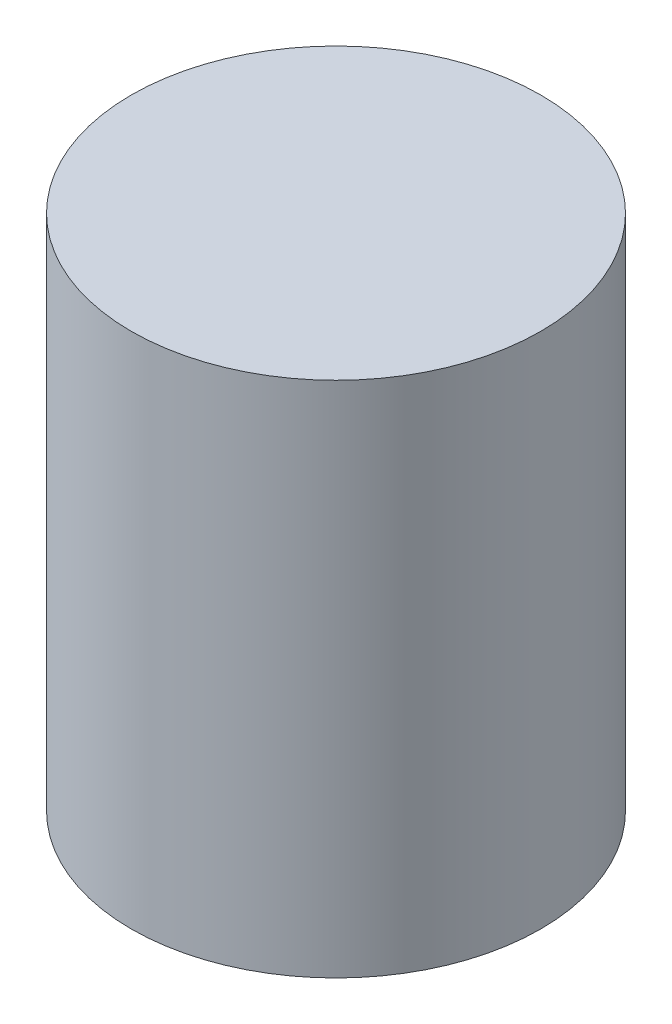
ISO-10303-21;
HEADER;
FILE_DESCRIPTION(('STEP AP214'),'2;1');
FILE_NAME('part.step','',(''),(''),'','','');
FILE_SCHEMA(('AUTOMOTIVE_DESIGN { 1 0 10303 214 1 1 1 1 }'));
ENDSEC;
DATA;
#1=APPLICATION_CONTEXT('core data for automotive mechanical design processes');
#2=APPLICATION_PROTOCOL_DEFINITION('international standard','automotive_design',2000,#1);
#3=PRODUCT_CONTEXT('',#1,'mechanical');
#4=PRODUCT('Part','Part','',(#3));
#5=PRODUCT_RELATED_PRODUCT_CATEGORY('part','',(#4));
#6=PRODUCT_DEFINITION_FORMATION('','',#4);
#7=PRODUCT_DEFINITION_CONTEXT('part definition',#1,'design');
#8=PRODUCT_DEFINITION('design','',#6,#7);
#9=PRODUCT_DEFINITION_SHAPE('','',#8);
#10=(LENGTH_UNIT() NAMED_UNIT(*) SI_UNIT(.MILLI.,.METRE.));
#11=(NAMED_UNIT(*) PLANE_ANGLE_UNIT() SI_UNIT($,.RADIAN.));
#12=(NAMED_UNIT(*) SI_UNIT($,.STERADIAN.) SOLID_ANGLE_UNIT());
#13=UNCERTAINTY_MEASURE_WITH_UNIT(LENGTH_MEASURE(1.E-05),#10,'distance_accuracy_value','');
#14=(GEOMETRIC_REPRESENTATION_CONTEXT(3) GLOBAL_UNCERTAINTY_ASSIGNED_CONTEXT((#13)) GLOBAL_UNIT_ASSIGNED_CONTEXT((#10,
#11,#12)) REPRESENTATION_CONTEXT('',''));
#15=CARTESIAN_POINT('',(0.,0.,0.));
#16=DIRECTION('',(0.,0.,1.));
#17=DIRECTION('',(1.,0.,0.));
#18=AXIS2_PLACEMENT_3D('',#15,#16,#17);
#19=CARTESIAN_POINT('',(0.,0.,0.));
#20=DIRECTION('',(0.,1.,0.));
#21=DIRECTION('',(0.,0.,1.));
#22=AXIS2_PLACEMENT_3D('',#19,#20,#21);
#23=PLANE('',#22);
#24=CARTESIAN_POINT('',(0.,0.,0.));
#25=DIRECTION('',(0.,1.,0.));
#26=DIRECTION('',(1.,0.,0.));
#27=AXIS2_PLACEMENT_3D('',#24,#25,#26);
#28=CIRCLE('',#27,25.);
#29=CARTESIAN_POINT('',(25.,0.,0.));
#30=VERTEX_POINT('',#29);
#31=EDGE_CURVE('E53',#30,#30,#28,.T.);
#32=ORIENTED_EDGE('',*,*,#31,.F.);
#33=EDGE_LOOP('',(#32));
#34=FACE_BOUND('',#33,.T.);
#35=CARTESIAN_POINT('',(0.,0.,0.));
#36=DIRECTION('',(0.,1.,0.));
#37=DIRECTION('',(0.,0.,1.));
#38=AXIS2_PLACEMENT_3D('',#35,#36,#37);
#39=CIRCLE('',#38,23.);
#40=CARTESIAN_POINT('',(0.,0.,23.));
#41=VERTEX_POINT('',#40);
#42=EDGE_CURVE('E58',#41,#41,#39,.T.);
#43=ORIENTED_EDGE('',*,*,#42,.T.);
#44=EDGE_LOOP('',(#43));
#45=FACE_BOUND('',#44,.T.);
#46=ADVANCED_FACE('F41',(#34,#45),#23,.F.);
#47=CARTESIAN_POINT('',(0.,30.,0.));
#48=DIRECTION('',(0.,-1.,0.));
#49=DIRECTION('',(0.,0.,-1.));
#50=AXIS2_PLACEMENT_3D('',#47,#48,#49);
#51=CYLINDRICAL_SURFACE('',#50,25.);
#52=CARTESIAN_POINT('',(0.,30.,0.));
#53=DIRECTION('',(0.,1.,0.));
#54=DIRECTION('',(1.,0.,0.));
#55=AXIS2_PLACEMENT_3D('',#52,#53,#54);
#56=CIRCLE('',#55,25.);
#57=CARTESIAN_POINT('',(25.,30.,0.));
#58=VERTEX_POINT('',#57);
#59=EDGE_CURVE('E49',#58,#58,#56,.T.);
#60=ORIENTED_EDGE('',*,*,#59,.F.);
#61=EDGE_LOOP('',(#60));
#62=FACE_BOUND('',#61,.T.);
#63=ORIENTED_EDGE('',*,*,#31,.T.);
#64=EDGE_LOOP('',(#63));
#65=FACE_BOUND('',#64,.T.);
#66=ADVANCED_FACE('F43',(#62,#65),#51,.T.);
#67=CARTESIAN_POINT('',(0.,30.,0.));
#68=DIRECTION('',(0.,-1.,0.));
#69=DIRECTION('',(0.,0.,-1.));
#70=AXIS2_PLACEMENT_3D('',#67,#68,#69);
#71=CYLINDRICAL_SURFACE('',#70,23.);
#72=CARTESIAN_POINT('',(0.,30.,0.));
#73=DIRECTION('',(0.,1.,0.));
#74=DIRECTION('',(0.,0.,1.));
#75=AXIS2_PLACEMENT_3D('',#72,#73,#74);
#76=CIRCLE('',#75,23.);
#77=CARTESIAN_POINT('',(0.,30.,23.));
#78=VERTEX_POINT('',#77);
#79=EDGE_CURVE('E62',#78,#78,#76,.T.);
#80=ORIENTED_EDGE('',*,*,#79,.T.);
#81=EDGE_LOOP('',(#80));
#82=FACE_BOUND('',#81,.T.);
#83=ORIENTED_EDGE('',*,*,#42,.F.);
#84=EDGE_LOOP('',(#83));
#85=FACE_BOUND('',#84,.T.);
#86=ADVANCED_FACE('F88',(#82,#85),#71,.F.);
#87=CARTESIAN_POINT('',(0.,30.,0.));
#88=DIRECTION('',(0.,1.,0.));
#89=DIRECTION('',(0.,0.,1.));
#90=AXIS2_PLACEMENT_3D('',#87,#88,#89);
#91=PLANE('',#90);
#92=ORIENTED_EDGE('',*,*,#79,.F.);
#93=EDGE_LOOP('',(#92));
#94=FACE_BOUND('',#93,.T.);
#95=ADVANCED_FACE('F80',(#94),#91,.F.);
#96=CARTESIAN_POINT('',(0.,32.,0.));
#97=DIRECTION('',(0.,-1.,0.));
#98=DIRECTION('',(0.,0.,-1.));
#99=AXIS2_PLACEMENT_3D('',#96,#97,#98);
#100=CYLINDRICAL_SURFACE('',#99,140.);
#101=CARTESIAN_POINT('',(0.,30.,0.));
#102=DIRECTION('',(0.,1.,0.));
#103=DIRECTION('',(0.,0.,1.));
#104=AXIS2_PLACEMENT_3D('',#101,#102,#103);
#105=CIRCLE('',#104,140.);
#106=CARTESIAN_POINT('',(0.,30.,140.));
#107=VERTEX_POINT('',#106);
#108=EDGE_CURVE('E65',#107,#107,#105,.T.);
#109=ORIENTED_EDGE('',*,*,#108,.T.);
#110=EDGE_LOOP('',(#109));
#111=FACE_BOUND('',#110,.T.);
#112=CARTESIAN_POINT('',(0.,384.,0.));
#113=DIRECTION('',(0.,1.,0.));
#114=DIRECTION('',(0.,0.,1.));
#115=AXIS2_PLACEMENT_3D('',#112,#113,#114);
#116=CIRCLE('',#115,140.);
#117=CARTESIAN_POINT('',(0.,384.,140.));
#118=VERTEX_POINT('',#117);
#119=EDGE_CURVE('E71',#118,#118,#116,.T.);
#120=ORIENTED_EDGE('',*,*,#119,.F.);
#121=EDGE_LOOP('',(#120));
#122=FACE_BOUND('',#121,.T.);
#123=ADVANCED_FACE('F77',(#111,#122),#100,.T.);
#124=ORIENTED_EDGE('',*,*,#59,.T.);
#125=EDGE_LOOP('',(#124));
#126=FACE_BOUND('',#125,.T.);
#127=ORIENTED_EDGE('',*,*,#108,.F.);
#128=EDGE_LOOP('',(#127));
#129=FACE_BOUND('',#128,.T.);
#130=ADVANCED_FACE('F79',(#126,#129),#91,.F.);
#131=CARTESIAN_POINT('',(0.,384.,0.));
#132=DIRECTION('',(0.,1.,0.));
#133=DIRECTION('',(0.,0.,1.));
#134=AXIS2_PLACEMENT_3D('',#131,#132,#133);
#135=PLANE('',#134);
#136=ORIENTED_EDGE('',*,*,#119,.T.);
#137=EDGE_LOOP('',(#136));
#138=FACE_BOUND('',#137,.T.);
#139=ADVANCED_FACE('F75',(#138),#135,.T.);
#140=CLOSED_SHELL('',(#46,#66,#86,#95,#123,#130,#139));
#141=CARTESIAN_POINT('',(0.,32.,0.));
#142=DIRECTION('',(0.,1.,0.));
#143=DIRECTION('',(0.,0.,1.));
#144=AXIS2_PLACEMENT_3D('',#141,#142,#143);
#145=PLANE('',#144);
#146=CARTESIAN_POINT('',(0.,32.,0.));
#147=DIRECTION('',(0.,1.,0.));
#148=DIRECTION('',(0.,0.,1.));
#149=AXIS2_PLACEMENT_3D('',#146,#147,#148);
#150=CIRCLE('',#149,138.);
#151=CARTESIAN_POINT('',(0.,32.,138.));
#152=VERTEX_POINT('',#151);
#153=EDGE_CURVE('E11',#152,#152,#150,.F.);
#154=ORIENTED_EDGE('',*,*,#153,.F.);
#155=EDGE_LOOP('',(#154));
#156=FACE_BOUND('',#155,.T.);
#157=ADVANCED_FACE('F132',(#156),#145,.T.);
#158=CARTESIAN_POINT('',(0.,382.,0.));
#159=DIRECTION('',(0.,-1.,0.));
#160=DIRECTION('',(0.,0.,-1.));
#161=AXIS2_PLACEMENT_3D('',#158,#159,#160);
#162=CYLINDRICAL_SURFACE('',#161,138.);
#163=CARTESIAN_POINT('',(0.,382.,0.));
#164=DIRECTION('',(0.,1.,0.));
#165=DIRECTION('',(0.,0.,1.));
#166=AXIS2_PLACEMENT_3D('',#163,#164,#165);
#167=CIRCLE('',#166,138.);
#168=CARTESIAN_POINT('',(0.,382.,138.));
#169=VERTEX_POINT('',#168);
#170=EDGE_CURVE('E68',#169,#169,#167,.T.);
#171=ORIENTED_EDGE('',*,*,#170,.T.);
#172=EDGE_LOOP('',(#171));
#173=FACE_BOUND('',#172,.T.);
#174=ORIENTED_EDGE('',*,*,#153,.T.);
#175=EDGE_LOOP('',(#174));
#176=FACE_BOUND('',#175,.T.);
#177=ADVANCED_FACE('F126',(#173,#176),#162,.F.);
#178=CARTESIAN_POINT('',(0.,382.,0.));
#179=DIRECTION('',(0.,1.,0.));
#180=DIRECTION('',(0.,0.,1.));
#181=AXIS2_PLACEMENT_3D('',#178,#179,#180);
#182=PLANE('',#181);
#183=ORIENTED_EDGE('',*,*,#170,.F.);
#184=EDGE_LOOP('',(#183));
#185=FACE_BOUND('',#184,.T.);
#186=ADVANCED_FACE('F131',(#185),#182,.F.);
#187=CLOSED_SHELL('',(#157,#177,#186));
#188=ORIENTED_CLOSED_SHELL('',*,#187,.T.);
#189=BREP_WITH_VOIDS('B2',#140,(#188));
#190=ADVANCED_BREP_SHAPE_REPRESENTATION('',(#18,#189),#14);
#191=SHAPE_DEFINITION_REPRESENTATION(#9,#190);
ENDSEC;
END-ISO-10303-21;
